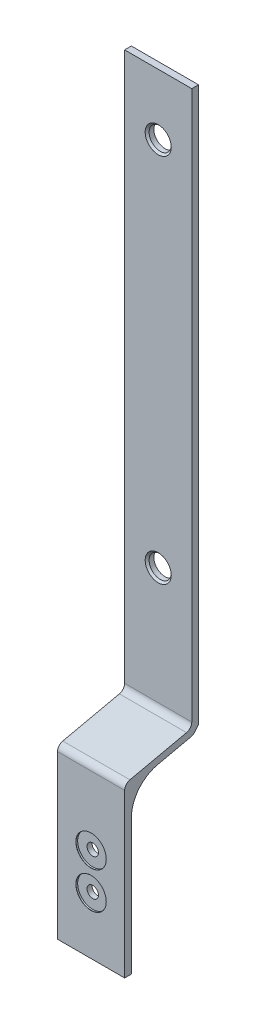
ISO-10303-21;
HEADER;
FILE_DESCRIPTION(('STEP AP214'),'2;1');
FILE_NAME('part.step','',(''),(''),'','','');
FILE_SCHEMA(('AUTOMOTIVE_DESIGN { 1 0 10303 214 1 1 1 1 }'));
ENDSEC;
DATA;
#1=APPLICATION_CONTEXT('core data for automotive mechanical design processes');
#2=APPLICATION_PROTOCOL_DEFINITION('international standard','automotive_design',2000,#1);
#3=PRODUCT_CONTEXT('',#1,'mechanical');
#4=PRODUCT('Part','Part','',(#3));
#5=PRODUCT_RELATED_PRODUCT_CATEGORY('part','',(#4));
#6=PRODUCT_DEFINITION_FORMATION('','',#4);
#7=PRODUCT_DEFINITION_CONTEXT('part definition',#1,'design');
#8=PRODUCT_DEFINITION('design','',#6,#7);
#9=PRODUCT_DEFINITION_SHAPE('','',#8);
#10=(LENGTH_UNIT() NAMED_UNIT(*) SI_UNIT(.MILLI.,.METRE.));
#11=(NAMED_UNIT(*) PLANE_ANGLE_UNIT() SI_UNIT($,.RADIAN.));
#12=(NAMED_UNIT(*) SI_UNIT($,.STERADIAN.) SOLID_ANGLE_UNIT());
#13=UNCERTAINTY_MEASURE_WITH_UNIT(LENGTH_MEASURE(1.E-05),#10,'distance_accuracy_value','');
#14=(GEOMETRIC_REPRESENTATION_CONTEXT(3) GLOBAL_UNCERTAINTY_ASSIGNED_CONTEXT((#13)) GLOBAL_UNIT_ASSIGNED_CONTEXT((#10,
#11,#12)) REPRESENTATION_CONTEXT('',''));
#15=CARTESIAN_POINT('',(0.,0.,0.));
#16=DIRECTION('',(0.,0.,1.));
#17=DIRECTION('',(1.,0.,0.));
#18=AXIS2_PLACEMENT_3D('',#15,#16,#17);
#19=CARTESIAN_POINT('',(-10.,-6.3803236087085,19.567706280451));
#20=DIRECTION('',(0.,-0.976360863108322,-0.216146859774489));
#21=DIRECTION('',(0.,0.216146859774489,-0.976360863108322));
#22=AXIS2_PLACEMENT_3D('',#19,#20,#21);
#23=PLANE('',#22);
#24=DIRECTION('',(0.,0.216146859774489,-0.976360863108322));
#25=VECTOR('',#24,1.);
#26=CARTESIAN_POINT('',(-10.,-6.3803236087085,19.567706280451));
#27=LINE('',#26,#25);
#28=CARTESIAN_POINT('',(-10.,-4.29796982515272,10.1614685977449));
#29=VERTEX_POINT('',#28);
#30=CARTESIAN_POINT('',(-10.,-2.10478080775789,0.25457508924133));
#31=VERTEX_POINT('',#30);
#32=EDGE_CURVE('E304',#29,#31,#27,.T.);
#33=ORIENTED_EDGE('',*,*,#32,.T.);
#34=DIRECTION('',(1.,0.,0.));
#35=VECTOR('',#34,1.);
#36=CARTESIAN_POINT('',(10.,-2.10478080775789,0.254575089241331));
#37=LINE('',#36,#35);
#38=CARTESIAN_POINT('',(10.,-2.10478080775789,0.25457508924133));
#39=VERTEX_POINT('',#38);
#40=EDGE_CURVE('E199',#31,#39,#37,.T.);
#41=ORIENTED_EDGE('',*,*,#40,.T.);
#42=DIRECTION('',(0.,0.216146859774489,-0.976360863108322));
#43=VECTOR('',#42,1.);
#44=CARTESIAN_POINT('',(10.,-6.3803236087085,19.567706280451));
#45=LINE('',#44,#43);
#46=CARTESIAN_POINT('',(10.,-4.29796982515272,10.1614685977449));
#47=VERTEX_POINT('',#46);
#48=EDGE_CURVE('E302',#47,#39,#45,.T.);
#49=ORIENTED_EDGE('',*,*,#48,.F.);
#50=DIRECTION('',(1.,0.,0.));
#51=VECTOR('',#50,1.);
#52=CARTESIAN_POINT('',(-10.,-4.29796982515272,10.1614685977449));
#53=LINE('',#52,#51);
#54=EDGE_CURVE('E415',#47,#29,#53,.F.);
#55=ORIENTED_EDGE('',*,*,#54,.T.);
#56=EDGE_LOOP('',(#33,#41,#49,#55));
#57=FACE_BOUND('',#56,.T.);
#58=ADVANCED_FACE('F44',(#57),#23,.T.);
#59=CARTESIAN_POINT('',(-10.,-4.42760188249185,20.));
#60=DIRECTION('',(0.,-0.976360863108322,-0.216146859774489));
#61=DIRECTION('',(0.,0.216146859774489,-0.976360863108322));
#62=AXIS2_PLACEMENT_3D('',#59,#60,#61);
#63=PLANE('',#62);
#64=DIRECTION('',(0.,0.216146859774489,-0.976360863108322));
#65=VECTOR('',#64,1.);
#66=CARTESIAN_POINT('',(10.,-4.42760188249185,20.));
#67=LINE('',#66,#65);
#68=CARTESIAN_POINT('',(10.,-4.08054291856589,18.432293719549));
#69=VERTEX_POINT('',#68);
#70=CARTESIAN_POINT('',(10.,-0.347058963925962,1.56770628045102));
#71=VERTEX_POINT('',#70);
#72=EDGE_CURVE('E309',#69,#71,#67,.T.);
#73=ORIENTED_EDGE('',*,*,#72,.T.);
#74=DIRECTION('',(1.,0.,0.));
#75=VECTOR('',#74,1.);
#76=CARTESIAN_POINT('',(-10.,-0.347058963925962,1.56770628045102));
#77=LINE('',#76,#75);
#78=CARTESIAN_POINT('',(-10.,-0.347058963925962,1.56770628045102));
#79=VERTEX_POINT('',#78);
#80=EDGE_CURVE('E67',#71,#79,#77,.F.);
#81=ORIENTED_EDGE('',*,*,#80,.T.);
#82=DIRECTION('',(0.,0.216146859774489,-0.976360863108322));
#83=VECTOR('',#82,1.);
#84=CARTESIAN_POINT('',(-10.,-4.42760188249185,20.));
#85=LINE('',#84,#83);
#86=CARTESIAN_POINT('',(-10.,-4.08054291856589,18.432293719549));
#87=VERTEX_POINT('',#86);
#88=EDGE_CURVE('E416',#87,#79,#85,.T.);
#89=ORIENTED_EDGE('',*,*,#88,.F.);
#90=DIRECTION('',(1.,0.,0.));
#91=VECTOR('',#90,1.);
#92=CARTESIAN_POINT('',(-10.,-4.08054291856589,18.432293719549));
#93=LINE('',#92,#91);
#94=EDGE_CURVE('E421',#87,#69,#93,.T.);
#95=ORIENTED_EDGE('',*,*,#94,.T.);
#96=EDGE_LOOP('',(#73,#81,#89,#95));
#97=FACE_BOUND('',#96,.T.);
#98=ADVANCED_FACE('F269',(#97),#63,.F.);
#99=CARTESIAN_POINT('',(-10.,0.,0.));
#100=DIRECTION('',(-1.,0.,0.));
#101=DIRECTION('',(0.,0.,1.));
#102=AXIS2_PLACEMENT_3D('',#99,#100,#101);
#103=PLANE('',#102);
#104=DIRECTION('',(0.,-0.779790632084821,0.626040390160855));
#105=VECTOR('',#104,1.);
#106=CARTESIAN_POINT('',(-10.,-0.976360863108322,-1.21614685977449));
#107=LINE('',#106,#105);
#108=CARTESIAN_POINT('',(-10.,0.,-2.));
#109=VERTEX_POINT('',#108);
#110=CARTESIAN_POINT('',(-10.,-1.40413986186296,-0.872712455379337));
#111=VERTEX_POINT('',#110);
#112=EDGE_CURVE('E187',#109,#111,#107,.T.);
#113=ORIENTED_EDGE('',*,*,#112,.T.);
#114=CARTESIAN_POINT('',(-10.,-0.152059081541245,0.686868808790309));
#115=DIRECTION('',(-1.,0.,0.));
#116=DIRECTION('',(0.,0.,1.));
#117=AXIS2_PLACEMENT_3D('',#114,#115,#116);
#118=CIRCLE('',#117,2.);
#119=EDGE_CURVE('E209',#111,#31,#118,.T.);
#120=ORIENTED_EDGE('',*,*,#119,.T.);
#121=ORIENTED_EDGE('',*,*,#32,.F.);
#122=CARTESIAN_POINT('',(-10.,-14.0615784562359,8.));
#123=DIRECTION('',(-1.,0.,0.));
#124=DIRECTION('',(0.,0.,1.));
#125=AXIS2_PLACEMENT_3D('',#122,#123,#124);
#126=CIRCLE('',#125,10.);
#127=CARTESIAN_POINT('',(-10.,-14.0615784562359,18.));
#128=VERTEX_POINT('',#127);
#129=EDGE_CURVE('E419',#29,#128,#126,.F.);
#130=ORIENTED_EDGE('',*,*,#129,.T.);
#131=DIRECTION('',(0.,-1.,0.));
#132=VECTOR('',#131,1.);
#133=CARTESIAN_POINT('',(-10.,-4.42760188249185,18.));
#134=LINE('',#133,#132);
#135=CARTESIAN_POINT('',(-10.,-54.4276018824919,18.));
#136=VERTEX_POINT('',#135);
#137=EDGE_CURVE('E398',#128,#136,#134,.T.);
#138=ORIENTED_EDGE('',*,*,#137,.T.);
#139=DIRECTION('',(0.,0.,1.));
#140=VECTOR('',#139,1.);
#141=CARTESIAN_POINT('',(-10.,-54.4276018824919,18.));
#142=LINE('',#141,#140);
#143=CARTESIAN_POINT('',(-10.,-54.4276018824919,20.));
#144=VERTEX_POINT('',#143);
#145=EDGE_CURVE('E313',#136,#144,#142,.T.);
#146=ORIENTED_EDGE('',*,*,#145,.T.);
#147=DIRECTION('',(0.,-1.,0.));
#148=VECTOR('',#147,1.);
#149=CARTESIAN_POINT('',(-10.,-4.42760188249185,20.));
#150=LINE('',#149,#148);
#151=CARTESIAN_POINT('',(-10.,-6.03326464478253,20.));
#152=VERTEX_POINT('',#151);
#153=EDGE_CURVE('E406',#152,#144,#150,.T.);
#154=ORIENTED_EDGE('',*,*,#153,.F.);
#155=CARTESIAN_POINT('',(-10.,-6.03326464478253,18.));
#156=DIRECTION('',(-1.,0.,0.));
#157=DIRECTION('',(0.,0.,1.));
#158=AXIS2_PLACEMENT_3D('',#155,#156,#157);
#159=CIRCLE('',#158,2.);
#160=EDGE_CURVE('E203',#152,#87,#159,.T.);
#161=ORIENTED_EDGE('',*,*,#160,.T.);
#162=ORIENTED_EDGE('',*,*,#88,.T.);
#163=CARTESIAN_POINT('',(-10.,1.60566276229068,2.));
#164=DIRECTION('',(-1.,0.,0.));
#165=DIRECTION('',(0.,0.,1.));
#166=AXIS2_PLACEMENT_3D('',#163,#164,#165);
#167=CIRCLE('',#166,2.);
#168=CARTESIAN_POINT('',(-10.,1.60566276229068,0.));
#169=VERTEX_POINT('',#168);
#170=EDGE_CURVE('E12',#79,#169,#167,.F.);
#171=ORIENTED_EDGE('',*,*,#170,.T.);
#172=DIRECTION('',(0.,1.,0.));
#173=VECTOR('',#172,1.);
#174=CARTESIAN_POINT('',(-10.,0.,0.));
#175=LINE('',#174,#173);
#176=CARTESIAN_POINT('',(-10.,165.,0.));
#177=VERTEX_POINT('',#176);
#178=EDGE_CURVE('E159',#169,#177,#175,.T.);
#179=ORIENTED_EDGE('',*,*,#178,.T.);
#180=DIRECTION('',(0.,0.,1.));
#181=VECTOR('',#180,1.);
#182=CARTESIAN_POINT('',(-10.,165.,-2.));
#183=LINE('',#182,#181);
#184=CARTESIAN_POINT('',(-10.,165.,-2.));
#185=VERTEX_POINT('',#184);
#186=EDGE_CURVE('E156',#185,#177,#183,.T.);
#187=ORIENTED_EDGE('',*,*,#186,.F.);
#188=DIRECTION('',(0.,1.,0.));
#189=VECTOR('',#188,1.);
#190=CARTESIAN_POINT('',(-10.,0.,-2.));
#191=LINE('',#190,#189);
#192=EDGE_CURVE('E142',#109,#185,#191,.T.);
#193=ORIENTED_EDGE('',*,*,#192,.F.);
#194=EDGE_LOOP('',(#113,#120,#121,#130,#138,#146,#154,#161,#162,#171,#179,#187,#193));
#195=FACE_BOUND('',#194,.T.);
#196=ADVANCED_FACE('F157',(#195),#103,.T.);
#197=CARTESIAN_POINT('',(10.,0.,0.));
#198=DIRECTION('',(-1.,0.,0.));
#199=DIRECTION('',(0.,0.,1.));
#200=AXIS2_PLACEMENT_3D('',#197,#198,#199);
#201=PLANE('',#200);
#202=ORIENTED_EDGE('',*,*,#48,.T.);
#203=CARTESIAN_POINT('',(10.,-0.152059081541245,0.686868808790309));
#204=DIRECTION('',(-1.,0.,0.));
#205=DIRECTION('',(0.,0.,1.));
#206=AXIS2_PLACEMENT_3D('',#203,#204,#205);
#207=CIRCLE('',#206,2.);
#208=CARTESIAN_POINT('',(10.,-1.40413986186296,-0.872712455379336));
#209=VERTEX_POINT('',#208);
#210=EDGE_CURVE('E202',#39,#209,#207,.F.);
#211=ORIENTED_EDGE('',*,*,#210,.T.);
#212=DIRECTION('',(0.,-0.779790632084821,0.626040390160855));
#213=VECTOR('',#212,1.);
#214=CARTESIAN_POINT('',(10.,0.,-2.));
#215=LINE('',#214,#213);
#216=CARTESIAN_POINT('',(10.,0.,-2.));
#217=VERTEX_POINT('',#216);
#218=EDGE_CURVE('E182',#217,#209,#215,.T.);
#219=ORIENTED_EDGE('',*,*,#218,.F.);
#220=DIRECTION('',(0.,1.,0.));
#221=VECTOR('',#220,1.);
#222=CARTESIAN_POINT('',(10.,0.,-2.));
#223=LINE('',#222,#221);
#224=CARTESIAN_POINT('',(10.,165.,-2.));
#225=VERTEX_POINT('',#224);
#226=EDGE_CURVE('E167',#217,#225,#223,.T.);
#227=ORIENTED_EDGE('',*,*,#226,.T.);
#228=DIRECTION('',(0.,0.,1.));
#229=VECTOR('',#228,1.);
#230=CARTESIAN_POINT('',(10.,165.,-2.));
#231=LINE('',#230,#229);
#232=CARTESIAN_POINT('',(10.,165.,0.));
#233=VERTEX_POINT('',#232);
#234=EDGE_CURVE('E163',#225,#233,#231,.T.);
#235=ORIENTED_EDGE('',*,*,#234,.T.);
#236=DIRECTION('',(0.,1.,0.));
#237=VECTOR('',#236,1.);
#238=CARTESIAN_POINT('',(10.,0.,0.));
#239=LINE('',#238,#237);
#240=CARTESIAN_POINT('',(10.,1.60566276229068,0.));
#241=VERTEX_POINT('',#240);
#242=EDGE_CURVE('E153',#241,#233,#239,.T.);
#243=ORIENTED_EDGE('',*,*,#242,.F.);
#244=CARTESIAN_POINT('',(10.,1.60566276229068,2.));
#245=DIRECTION('',(-1.,0.,0.));
#246=DIRECTION('',(0.,0.,1.));
#247=AXIS2_PLACEMENT_3D('',#244,#245,#246);
#248=CIRCLE('',#247,2.);
#249=EDGE_CURVE('E53',#241,#71,#248,.T.);
#250=ORIENTED_EDGE('',*,*,#249,.T.);
#251=ORIENTED_EDGE('',*,*,#72,.F.);
#252=CARTESIAN_POINT('',(10.,-6.03326464478253,18.));
#253=DIRECTION('',(-1.,0.,0.));
#254=DIRECTION('',(0.,0.,1.));
#255=AXIS2_PLACEMENT_3D('',#252,#253,#254);
#256=CIRCLE('',#255,2.);
#257=CARTESIAN_POINT('',(10.,-6.03326464478253,20.));
#258=VERTEX_POINT('',#257);
#259=EDGE_CURVE('E424',#69,#258,#256,.F.);
#260=ORIENTED_EDGE('',*,*,#259,.T.);
#261=DIRECTION('',(0.,1.,0.));
#262=VECTOR('',#261,1.);
#263=CARTESIAN_POINT('',(10.,-4.42760188249185,20.));
#264=LINE('',#263,#262);
#265=CARTESIAN_POINT('',(9.99999999999999,-54.4276018824919,20.));
#266=VERTEX_POINT('',#265);
#267=EDGE_CURVE('E186',#266,#258,#264,.T.);
#268=ORIENTED_EDGE('',*,*,#267,.F.);
#269=DIRECTION('',(0.,0.,1.));
#270=VECTOR('',#269,1.);
#271=CARTESIAN_POINT('',(9.99999999999999,-54.4276018824919,18.));
#272=LINE('',#271,#270);
#273=CARTESIAN_POINT('',(9.99999999999999,-54.4276018824919,18.));
#274=VERTEX_POINT('',#273);
#275=EDGE_CURVE('E310',#274,#266,#272,.T.);
#276=ORIENTED_EDGE('',*,*,#275,.F.);
#277=DIRECTION('',(0.,1.,0.));
#278=VECTOR('',#277,1.);
#279=CARTESIAN_POINT('',(10.,-4.42760188249185,18.));
#280=LINE('',#279,#278);
#281=CARTESIAN_POINT('',(10.,-14.0615784562359,18.));
#282=VERTEX_POINT('',#281);
#283=EDGE_CURVE('E396',#274,#282,#280,.T.);
#284=ORIENTED_EDGE('',*,*,#283,.T.);
#285=CARTESIAN_POINT('',(10.,-14.0615784562359,8.));
#286=DIRECTION('',(-1.,0.,0.));
#287=DIRECTION('',(0.,0.,1.));
#288=AXIS2_PLACEMENT_3D('',#285,#286,#287);
#289=CIRCLE('',#288,10.);
#290=EDGE_CURVE('E308',#282,#47,#289,.T.);
#291=ORIENTED_EDGE('',*,*,#290,.T.);
#292=EDGE_LOOP('',(#202,#211,#219,#227,#235,#243,#250,#251,#260,#268,#276,#284,#291));
#293=FACE_BOUND('',#292,.T.);
#294=ADVANCED_FACE('F305',(#293),#201,.F.);
#295=CARTESIAN_POINT('',(9.99999999999999,-54.4276018824919,18.));
#296=DIRECTION('',(0.,-1.,0.));
#297=DIRECTION('',(0.,0.,-1.));
#298=AXIS2_PLACEMENT_3D('',#295,#296,#297);
#299=PLANE('',#298);
#300=DIRECTION('',(1.,0.,0.));
#301=VECTOR('',#300,1.);
#302=CARTESIAN_POINT('',(9.99999999999999,-54.4276018824919,20.));
#303=LINE('',#302,#301);
#304=EDGE_CURVE('E399',#144,#266,#303,.T.);
#305=ORIENTED_EDGE('',*,*,#304,.F.);
#306=ORIENTED_EDGE('',*,*,#145,.F.);
#307=DIRECTION('',(1.,0.,0.));
#308=VECTOR('',#307,1.);
#309=CARTESIAN_POINT('',(9.99999999999999,-54.4276018824919,18.));
#310=LINE('',#309,#308);
#311=EDGE_CURVE('E401',#136,#274,#310,.T.);
#312=ORIENTED_EDGE('',*,*,#311,.T.);
#313=ORIENTED_EDGE('',*,*,#275,.T.);
#314=EDGE_LOOP('',(#305,#306,#312,#313));
#315=FACE_BOUND('',#314,.T.);
#316=ADVANCED_FACE('F335',(#315),#299,.T.);
#317=CARTESIAN_POINT('',(0.,0.,18.));
#318=DIRECTION('',(0.,0.,-1.));
#319=DIRECTION('',(-1.,0.,0.));
#320=AXIS2_PLACEMENT_3D('',#317,#318,#319);
#321=PLANE('',#320);
#322=CARTESIAN_POINT('',(0.,-26.530198890695,18.));
#323=DIRECTION('',(0.,0.,-1.));
#324=DIRECTION('',(-1.,0.,0.));
#325=AXIS2_PLACEMENT_3D('',#322,#323,#324);
#326=CIRCLE('',#325,1.7);
#327=CARTESIAN_POINT('',(-1.7,-26.530198890695,18.));
#328=VERTEX_POINT('',#327);
#329=EDGE_CURVE('E48',#328,#328,#326,.T.);
#330=ORIENTED_EDGE('',*,*,#329,.F.);
#331=EDGE_LOOP('',(#330));
#332=FACE_BOUND('',#331,.T.);
#333=CARTESIAN_POINT('',(0.,-37.480198890695,18.));
#334=DIRECTION('',(0.,0.,-1.));
#335=DIRECTION('',(-1.,0.,0.));
#336=AXIS2_PLACEMENT_3D('',#333,#334,#335);
#337=CIRCLE('',#336,1.7);
#338=CARTESIAN_POINT('',(-1.70000000000001,-37.480198890695,18.));
#339=VERTEX_POINT('',#338);
#340=EDGE_CURVE('E228',#339,#339,#337,.T.);
#341=ORIENTED_EDGE('',*,*,#340,.F.);
#342=EDGE_LOOP('',(#341));
#343=FACE_BOUND('',#342,.T.);
#344=ORIENTED_EDGE('',*,*,#137,.F.);
#345=DIRECTION('',(1.,0.,0.));
#346=VECTOR('',#345,1.);
#347=CARTESIAN_POINT('',(10.,-14.0615784562359,18.));
#348=LINE('',#347,#346);
#349=EDGE_CURVE('E412',#128,#282,#348,.T.);
#350=ORIENTED_EDGE('',*,*,#349,.T.);
#351=ORIENTED_EDGE('',*,*,#283,.F.);
#352=ORIENTED_EDGE('',*,*,#311,.F.);
#353=EDGE_LOOP('',(#344,#350,#351,#352));
#354=FACE_BOUND('',#353,.T.);
#355=ADVANCED_FACE('F370',(#332,#343,#354),#321,.T.);
#356=CARTESIAN_POINT('',(0.,0.,20.));
#357=DIRECTION('',(0.,0.,-1.));
#358=DIRECTION('',(-1.,0.,0.));
#359=AXIS2_PLACEMENT_3D('',#356,#357,#358);
#360=PLANE('',#359);
#361=CARTESIAN_POINT('',(0.,-26.530198890695,20.));
#362=DIRECTION('',(0.,0.,1.));
#363=DIRECTION('',(1.,0.,0.));
#364=AXIS2_PLACEMENT_3D('',#361,#362,#363);
#365=CIRCLE('',#364,4.525);
#366=CARTESIAN_POINT('',(4.525,-26.530198890695,20.));
#367=VERTEX_POINT('',#366);
#368=EDGE_CURVE('E575',#367,#367,#365,.T.);
#369=ORIENTED_EDGE('',*,*,#368,.F.);
#370=EDGE_LOOP('',(#369));
#371=FACE_BOUND('',#370,.T.);
#372=CARTESIAN_POINT('',(0.,-37.480198890695,20.));
#373=DIRECTION('',(0.,0.,1.));
#374=DIRECTION('',(1.,0.,0.));
#375=AXIS2_PLACEMENT_3D('',#372,#373,#374);
#376=CIRCLE('',#375,4.525);
#377=CARTESIAN_POINT('',(4.525,-37.480198890695,20.));
#378=VERTEX_POINT('',#377);
#379=EDGE_CURVE('E460',#378,#378,#376,.T.);
#380=ORIENTED_EDGE('',*,*,#379,.F.);
#381=EDGE_LOOP('',(#380));
#382=FACE_BOUND('',#381,.T.);
#383=ORIENTED_EDGE('',*,*,#267,.T.);
#384=DIRECTION('',(1.,0.,0.));
#385=VECTOR('',#384,1.);
#386=CARTESIAN_POINT('',(0.,-6.03326464478253,20.));
#387=LINE('',#386,#385);
#388=EDGE_CURVE('E426',#258,#152,#387,.F.);
#389=ORIENTED_EDGE('',*,*,#388,.T.);
#390=ORIENTED_EDGE('',*,*,#153,.T.);
#391=ORIENTED_EDGE('',*,*,#304,.T.);
#392=EDGE_LOOP('',(#383,#389,#390,#391));
#393=FACE_BOUND('',#392,.T.);
#394=ADVANCED_FACE('F282',(#371,#382,#393),#360,.F.);
#395=CARTESIAN_POINT('',(0.,-14.0615784562359,8.));
#396=DIRECTION('',(-1.,0.,0.));
#397=DIRECTION('',(0.,0.,1.));
#398=AXIS2_PLACEMENT_3D('',#395,#396,#397);
#399=CYLINDRICAL_SURFACE('',#398,10.);
#400=ORIENTED_EDGE('',*,*,#129,.F.);
#401=ORIENTED_EDGE('',*,*,#54,.F.);
#402=ORIENTED_EDGE('',*,*,#290,.F.);
#403=ORIENTED_EDGE('',*,*,#349,.F.);
#404=EDGE_LOOP('',(#400,#401,#402,#403));
#405=FACE_BOUND('',#404,.T.);
#406=ADVANCED_FACE('F278',(#405),#399,.F.);
#407=CARTESIAN_POINT('',(-10.,-6.03326464478253,18.));
#408=DIRECTION('',(1.,0.,0.));
#409=DIRECTION('',(0.,0.,-1.));
#410=AXIS2_PLACEMENT_3D('',#407,#408,#409);
#411=CYLINDRICAL_SURFACE('',#410,2.);
#412=ORIENTED_EDGE('',*,*,#160,.F.);
#413=ORIENTED_EDGE('',*,*,#388,.F.);
#414=ORIENTED_EDGE('',*,*,#259,.F.);
#415=ORIENTED_EDGE('',*,*,#94,.F.);
#416=EDGE_LOOP('',(#412,#413,#414,#415));
#417=FACE_BOUND('',#416,.T.);
#418=ADVANCED_FACE('F281',(#417),#411,.T.);
#419=CARTESIAN_POINT('',(0.,-0.976360863108322,-1.21614685977449));
#420=DIRECTION('',(0.,0.626040390160855,0.779790632084821));
#421=DIRECTION('',(0.,-0.779790632084821,0.626040390160855));
#422=AXIS2_PLACEMENT_3D('',#419,#420,#421);
#423=PLANE('',#422);
#424=ORIENTED_EDGE('',*,*,#218,.T.);
#425=DIRECTION('',(1.,0.,0.));
#426=VECTOR('',#425,1.);
#427=CARTESIAN_POINT('',(-10.,-1.40413986186296,-0.872712455379337));
#428=LINE('',#427,#426);
#429=EDGE_CURVE('E205',#209,#111,#428,.F.);
#430=ORIENTED_EDGE('',*,*,#429,.T.);
#431=ORIENTED_EDGE('',*,*,#112,.F.);
#432=DIRECTION('',(-1.,0.,0.));
#433=VECTOR('',#432,1.);
#434=CARTESIAN_POINT('',(10.,0.,-2.));
#435=LINE('',#434,#433);
#436=EDGE_CURVE('E149',#217,#109,#435,.T.);
#437=ORIENTED_EDGE('',*,*,#436,.F.);
#438=EDGE_LOOP('',(#424,#430,#431,#437));
#439=FACE_BOUND('',#438,.T.);
#440=ADVANCED_FACE('F285',(#439),#423,.F.);
#441=CARTESIAN_POINT('',(10.,165.,-2.));
#442=DIRECTION('',(0.,1.,0.));
#443=DIRECTION('',(0.,0.,1.));
#444=AXIS2_PLACEMENT_3D('',#441,#442,#443);
#445=PLANE('',#444);
#446=DIRECTION('',(-1.,0.,0.));
#447=VECTOR('',#446,1.);
#448=CARTESIAN_POINT('',(10.,165.,0.));
#449=LINE('',#448,#447);
#450=EDGE_CURVE('E174',#233,#177,#449,.T.);
#451=ORIENTED_EDGE('',*,*,#450,.F.);
#452=ORIENTED_EDGE('',*,*,#234,.F.);
#453=DIRECTION('',(-1.,0.,0.));
#454=VECTOR('',#453,1.);
#455=CARTESIAN_POINT('',(10.,165.,-2.));
#456=LINE('',#455,#454);
#457=EDGE_CURVE('E147',#225,#185,#456,.T.);
#458=ORIENTED_EDGE('',*,*,#457,.T.);
#459=ORIENTED_EDGE('',*,*,#186,.T.);
#460=EDGE_LOOP('',(#451,#452,#458,#459));
#461=FACE_BOUND('',#460,.T.);
#462=ADVANCED_FACE('F165',(#461),#445,.T.);
#463=CARTESIAN_POINT('',(0.,0.,-2.));
#464=DIRECTION('',(0.,0.,-1.));
#465=DIRECTION('',(-1.,0.,0.));
#466=AXIS2_PLACEMENT_3D('',#463,#464,#465);
#467=PLANE('',#466);
#468=CARTESIAN_POINT('',(0.,146.829705843678,-2.));
#469=DIRECTION('',(0.,0.,-1.));
#470=DIRECTION('',(-1.,0.,0.));
#471=AXIS2_PLACEMENT_3D('',#468,#469,#470);
#472=CIRCLE('',#471,3.29999999999999);
#473=CARTESIAN_POINT('',(-3.29999999999999,146.829705843678,-2.));
#474=VERTEX_POINT('',#473);
#475=EDGE_CURVE('E224',#474,#474,#472,.T.);
#476=ORIENTED_EDGE('',*,*,#475,.F.);
#477=EDGE_LOOP('',(#476));
#478=FACE_BOUND('',#477,.T.);
#479=CARTESIAN_POINT('',(0.,36.4098011093045,-2.));
#480=DIRECTION('',(0.,0.,-1.));
#481=DIRECTION('',(-1.,0.,0.));
#482=AXIS2_PLACEMENT_3D('',#479,#480,#481);
#483=CIRCLE('',#482,3.29999999999999);
#484=CARTESIAN_POINT('',(-3.29999999999999,36.4098011093045,-2.));
#485=VERTEX_POINT('',#484);
#486=EDGE_CURVE('E221',#485,#485,#483,.T.);
#487=ORIENTED_EDGE('',*,*,#486,.F.);
#488=EDGE_LOOP('',(#487));
#489=FACE_BOUND('',#488,.T.);
#490=ORIENTED_EDGE('',*,*,#436,.T.);
#491=ORIENTED_EDGE('',*,*,#192,.T.);
#492=ORIENTED_EDGE('',*,*,#457,.F.);
#493=ORIENTED_EDGE('',*,*,#226,.F.);
#494=EDGE_LOOP('',(#490,#491,#492,#493));
#495=FACE_BOUND('',#494,.T.);
#496=ADVANCED_FACE('F144',(#478,#489,#495),#467,.T.);
#497=CARTESIAN_POINT('',(0.,0.,0.));
#498=DIRECTION('',(0.,0.,-1.));
#499=DIRECTION('',(-1.,0.,0.));
#500=AXIS2_PLACEMENT_3D('',#497,#498,#499);
#501=PLANE('',#500);
#502=CARTESIAN_POINT('',(0.,146.829705843678,0.));
#503=DIRECTION('',(0.,0.,1.));
#504=DIRECTION('',(1.,0.,0.));
#505=AXIS2_PLACEMENT_3D('',#502,#503,#504);
#506=CIRCLE('',#505,3.8865);
#507=CARTESIAN_POINT('',(3.8865,146.829705843678,0.));
#508=VERTEX_POINT('',#507);
#509=EDGE_CURVE('E230',#508,#508,#506,.T.);
#510=ORIENTED_EDGE('',*,*,#509,.F.);
#511=EDGE_LOOP('',(#510));
#512=FACE_BOUND('',#511,.T.);
#513=CARTESIAN_POINT('',(0.,36.4098011093045,0.));
#514=DIRECTION('',(0.,0.,1.));
#515=DIRECTION('',(1.,0.,0.));
#516=AXIS2_PLACEMENT_3D('',#513,#514,#515);
#517=CIRCLE('',#516,3.8865);
#518=CARTESIAN_POINT('',(3.8865,36.4098011093045,0.));
#519=VERTEX_POINT('',#518);
#520=EDGE_CURVE('E226',#519,#519,#517,.T.);
#521=ORIENTED_EDGE('',*,*,#520,.F.);
#522=EDGE_LOOP('',(#521));
#523=FACE_BOUND('',#522,.T.);
#524=ORIENTED_EDGE('',*,*,#178,.F.);
#525=DIRECTION('',(1.,0.,0.));
#526=VECTOR('',#525,1.);
#527=CARTESIAN_POINT('',(10.,1.60566276229068,0.));
#528=LINE('',#527,#526);
#529=EDGE_CURVE('E211',#169,#241,#528,.T.);
#530=ORIENTED_EDGE('',*,*,#529,.T.);
#531=ORIENTED_EDGE('',*,*,#242,.T.);
#532=ORIENTED_EDGE('',*,*,#450,.T.);
#533=EDGE_LOOP('',(#524,#530,#531,#532));
#534=FACE_BOUND('',#533,.T.);
#535=ADVANCED_FACE('F289',(#512,#523,#534),#501,.F.);
#536=CARTESIAN_POINT('',(-10.,-0.152059081541245,0.686868808790309));
#537=DIRECTION('',(-1.,0.,0.));
#538=DIRECTION('',(0.,0.,1.));
#539=AXIS2_PLACEMENT_3D('',#536,#537,#538);
#540=CYLINDRICAL_SURFACE('',#539,2.);
#541=ORIENTED_EDGE('',*,*,#119,.F.);
#542=ORIENTED_EDGE('',*,*,#429,.F.);
#543=ORIENTED_EDGE('',*,*,#210,.F.);
#544=ORIENTED_EDGE('',*,*,#40,.F.);
#545=EDGE_LOOP('',(#541,#542,#543,#544));
#546=FACE_BOUND('',#545,.T.);
#547=ADVANCED_FACE('F287',(#546),#540,.T.);
#548=CARTESIAN_POINT('',(0.,1.60566276229068,2.));
#549=DIRECTION('',(-1.,0.,0.));
#550=DIRECTION('',(0.,0.,1.));
#551=AXIS2_PLACEMENT_3D('',#548,#549,#550);
#552=CYLINDRICAL_SURFACE('',#551,2.);
#553=ORIENTED_EDGE('',*,*,#170,.F.);
#554=ORIENTED_EDGE('',*,*,#80,.F.);
#555=ORIENTED_EDGE('',*,*,#249,.F.);
#556=ORIENTED_EDGE('',*,*,#529,.F.);
#557=EDGE_LOOP('',(#553,#554,#555,#556));
#558=FACE_BOUND('',#557,.T.);
#559=ADVANCED_FACE('F46',(#558),#552,.F.);
#560=CARTESIAN_POINT('',(0.,36.4098011093045,0.));
#561=DIRECTION('',(0.,0.,1.));
#562=DIRECTION('',(1.,0.,0.));
#563=AXIS2_PLACEMENT_3D('',#560,#561,#562);
#564=CYLINDRICAL_SURFACE('',#563,3.29999999999999);
#565=ORIENTED_EDGE('',*,*,#486,.T.);
#566=EDGE_LOOP('',(#565));
#567=FACE_BOUND('',#566,.T.);
#568=CARTESIAN_POINT('',(0.,36.4098011093045,-0.586500000000004));
#569=DIRECTION('',(0.,0.,1.));
#570=DIRECTION('',(1.,0.,0.));
#571=AXIS2_PLACEMENT_3D('',#568,#569,#570);
#572=CIRCLE('',#571,3.29999999999999);
#573=CARTESIAN_POINT('',(3.29999999999999,36.4098011093045,-0.586500000000004));
#574=VERTEX_POINT('',#573);
#575=EDGE_CURVE('E172',#574,#574,#572,.T.);
#576=ORIENTED_EDGE('',*,*,#575,.T.);
#577=EDGE_LOOP('',(#576));
#578=FACE_BOUND('',#577,.T.);
#579=ADVANCED_FACE('F253',(#567,#578),#564,.F.);
#580=CARTESIAN_POINT('',(0.,36.4098011093045,0.));
#581=DIRECTION('',(0.,0.,1.));
#582=DIRECTION('',(1.,0.,0.));
#583=AXIS2_PLACEMENT_3D('',#580,#581,#582);
#584=CONICAL_SURFACE('',#583,3.8865,0.785398163397454);
#585=ORIENTED_EDGE('',*,*,#575,.F.);
#586=EDGE_LOOP('',(#585));
#587=FACE_BOUND('',#586,.T.);
#588=ORIENTED_EDGE('',*,*,#520,.T.);
#589=EDGE_LOOP('',(#588));
#590=FACE_BOUND('',#589,.T.);
#591=ADVANCED_FACE('F255',(#587,#590),#584,.F.);
#592=CARTESIAN_POINT('',(0.,146.829705843678,0.));
#593=DIRECTION('',(0.,0.,1.));
#594=DIRECTION('',(1.,0.,0.));
#595=AXIS2_PLACEMENT_3D('',#592,#593,#594);
#596=CYLINDRICAL_SURFACE('',#595,3.29999999999999);
#597=ORIENTED_EDGE('',*,*,#475,.T.);
#598=EDGE_LOOP('',(#597));
#599=FACE_BOUND('',#598,.T.);
#600=CARTESIAN_POINT('',(0.,146.829705843678,-0.586500000000004));
#601=DIRECTION('',(0.,0.,1.));
#602=DIRECTION('',(1.,0.,0.));
#603=AXIS2_PLACEMENT_3D('',#600,#601,#602);
#604=CIRCLE('',#603,3.29999999999999);
#605=CARTESIAN_POINT('',(3.29999999999999,146.829705843678,-0.586500000000004));
#606=VERTEX_POINT('',#605);
#607=EDGE_CURVE('E227',#606,#606,#604,.T.);
#608=ORIENTED_EDGE('',*,*,#607,.T.);
#609=EDGE_LOOP('',(#608));
#610=FACE_BOUND('',#609,.T.);
#611=ADVANCED_FACE('F257',(#599,#610),#596,.F.);
#612=CARTESIAN_POINT('',(0.,146.829705843678,0.));
#613=DIRECTION('',(0.,0.,1.));
#614=DIRECTION('',(1.,0.,0.));
#615=AXIS2_PLACEMENT_3D('',#612,#613,#614);
#616=CONICAL_SURFACE('',#615,3.8865,0.785398163397454);
#617=ORIENTED_EDGE('',*,*,#607,.F.);
#618=EDGE_LOOP('',(#617));
#619=FACE_BOUND('',#618,.T.);
#620=ORIENTED_EDGE('',*,*,#509,.T.);
#621=EDGE_LOOP('',(#620));
#622=FACE_BOUND('',#621,.T.);
#623=ADVANCED_FACE('F263',(#619,#622),#616,.F.);
#624=CARTESIAN_POINT('',(0.,-37.480198890695,20.));
#625=DIRECTION('',(0.,0.,1.));
#626=DIRECTION('',(1.,0.,0.));
#627=AXIS2_PLACEMENT_3D('',#624,#625,#626);
#628=CYLINDRICAL_SURFACE('',#627,1.7);
#629=ORIENTED_EDGE('',*,*,#340,.T.);
#630=EDGE_LOOP('',(#629));
#631=FACE_BOUND('',#630,.T.);
#632=CARTESIAN_POINT('',(0.,-37.480198890695,19.5));
#633=DIRECTION('',(0.,0.,1.));
#634=DIRECTION('',(1.,0.,0.));
#635=AXIS2_PLACEMENT_3D('',#632,#633,#634);
#636=CIRCLE('',#635,1.70000000000001);
#637=CARTESIAN_POINT('',(1.70000000000001,-37.480198890695,19.5));
#638=VERTEX_POINT('',#637);
#639=EDGE_CURVE('E231',#638,#638,#636,.T.);
#640=ORIENTED_EDGE('',*,*,#639,.T.);
#641=EDGE_LOOP('',(#640));
#642=FACE_BOUND('',#641,.T.);
#643=ADVANCED_FACE('F498',(#631,#642),#628,.F.);
#644=CARTESIAN_POINT('',(4.49999999999999,-37.480198890695,19.5));
#645=DIRECTION('',(0.,0.,-1.));
#646=DIRECTION('',(-1.,0.,0.));
#647=AXIS2_PLACEMENT_3D('',#644,#645,#646);
#648=PLANE('',#647);
#649=ORIENTED_EDGE('',*,*,#639,.F.);
#650=EDGE_LOOP('',(#649));
#651=FACE_BOUND('',#650,.T.);
#652=CARTESIAN_POINT('',(0.,-37.480198890695,19.5));
#653=DIRECTION('',(0.,0.,1.));
#654=DIRECTION('',(1.,0.,0.));
#655=AXIS2_PLACEMENT_3D('',#652,#653,#654);
#656=CIRCLE('',#655,4.49999999999999);
#657=CARTESIAN_POINT('',(4.49999999999999,-37.480198890695,19.5));
#658=VERTEX_POINT('',#657);
#659=EDGE_CURVE('E237',#658,#658,#656,.T.);
#660=ORIENTED_EDGE('',*,*,#659,.T.);
#661=EDGE_LOOP('',(#660));
#662=FACE_BOUND('',#661,.T.);
#663=ADVANCED_FACE('F491',(#651,#662),#648,.F.);
#664=CARTESIAN_POINT('',(0.,-37.480198890695,20.));
#665=DIRECTION('',(0.,0.,1.));
#666=DIRECTION('',(1.,0.,0.));
#667=AXIS2_PLACEMENT_3D('',#664,#665,#666);
#668=CYLINDRICAL_SURFACE('',#667,4.49999999999999);
#669=ORIENTED_EDGE('',*,*,#659,.F.);
#670=EDGE_LOOP('',(#669));
#671=FACE_BOUND('',#670,.T.);
#672=CARTESIAN_POINT('',(0.,-37.480198890695,19.975));
#673=DIRECTION('',(0.,0.,1.));
#674=DIRECTION('',(1.,0.,0.));
#675=AXIS2_PLACEMENT_3D('',#672,#673,#674);
#676=CIRCLE('',#675,4.49999999999999);
#677=CARTESIAN_POINT('',(4.49999999999999,-37.480198890695,19.975));
#678=VERTEX_POINT('',#677);
#679=EDGE_CURVE('E242',#678,#678,#676,.T.);
#680=ORIENTED_EDGE('',*,*,#679,.T.);
#681=EDGE_LOOP('',(#680));
#682=FACE_BOUND('',#681,.T.);
#683=ADVANCED_FACE('F476',(#671,#682),#668,.F.);
#684=CARTESIAN_POINT('',(0.,-37.480198890695,20.));
#685=DIRECTION('',(0.,0.,1.));
#686=DIRECTION('',(1.,0.,0.));
#687=AXIS2_PLACEMENT_3D('',#684,#685,#686);
#688=CONICAL_SURFACE('',#687,4.525,0.785398163397518);
#689=ORIENTED_EDGE('',*,*,#679,.F.);
#690=EDGE_LOOP('',(#689));
#691=FACE_BOUND('',#690,.T.);
#692=ORIENTED_EDGE('',*,*,#379,.T.);
#693=EDGE_LOOP('',(#692));
#694=FACE_BOUND('',#693,.T.);
#695=ADVANCED_FACE('F478',(#691,#694),#688,.F.);
#696=CARTESIAN_POINT('',(0.,-26.530198890695,20.));
#697=DIRECTION('',(0.,0.,1.));
#698=DIRECTION('',(1.,0.,0.));
#699=AXIS2_PLACEMENT_3D('',#696,#697,#698);
#700=CYLINDRICAL_SURFACE('',#699,1.7);
#701=ORIENTED_EDGE('',*,*,#329,.T.);
#702=EDGE_LOOP('',(#701));
#703=FACE_BOUND('',#702,.T.);
#704=CARTESIAN_POINT('',(0.,-26.530198890695,19.5));
#705=DIRECTION('',(0.,0.,1.));
#706=DIRECTION('',(1.,0.,0.));
#707=AXIS2_PLACEMENT_3D('',#704,#705,#706);
#708=CIRCLE('',#707,1.70000000000001);
#709=CARTESIAN_POINT('',(1.70000000000001,-26.530198890695,19.5));
#710=VERTEX_POINT('',#709);
#711=EDGE_CURVE('E461',#710,#710,#708,.T.);
#712=ORIENTED_EDGE('',*,*,#711,.T.);
#713=EDGE_LOOP('',(#712));
#714=FACE_BOUND('',#713,.T.);
#715=ADVANCED_FACE('F481',(#703,#714),#700,.F.);
#716=CARTESIAN_POINT('',(4.49999999999999,-26.530198890695,19.5));
#717=DIRECTION('',(0.,0.,-1.));
#718=DIRECTION('',(-1.,0.,0.));
#719=AXIS2_PLACEMENT_3D('',#716,#717,#718);
#720=PLANE('',#719);
#721=ORIENTED_EDGE('',*,*,#711,.F.);
#722=EDGE_LOOP('',(#721));
#723=FACE_BOUND('',#722,.T.);
#724=CARTESIAN_POINT('',(0.,-26.530198890695,19.5));
#725=DIRECTION('',(0.,0.,1.));
#726=DIRECTION('',(1.,0.,0.));
#727=AXIS2_PLACEMENT_3D('',#724,#725,#726);
#728=CIRCLE('',#727,4.49999999999999);
#729=CARTESIAN_POINT('',(4.49999999999999,-26.530198890695,19.5));
#730=VERTEX_POINT('',#729);
#731=EDGE_CURVE('E465',#730,#730,#728,.T.);
#732=ORIENTED_EDGE('',*,*,#731,.T.);
#733=EDGE_LOOP('',(#732));
#734=FACE_BOUND('',#733,.T.);
#735=ADVANCED_FACE('F489',(#723,#734),#720,.F.);
#736=CARTESIAN_POINT('',(0.,-26.530198890695,20.));
#737=DIRECTION('',(0.,0.,1.));
#738=DIRECTION('',(1.,0.,0.));
#739=AXIS2_PLACEMENT_3D('',#736,#737,#738);
#740=CYLINDRICAL_SURFACE('',#739,4.49999999999999);
#741=ORIENTED_EDGE('',*,*,#731,.F.);
#742=EDGE_LOOP('',(#741));
#743=FACE_BOUND('',#742,.T.);
#744=CARTESIAN_POINT('',(0.,-26.530198890695,19.975));
#745=DIRECTION('',(0.,0.,1.));
#746=DIRECTION('',(1.,0.,0.));
#747=AXIS2_PLACEMENT_3D('',#744,#745,#746);
#748=CIRCLE('',#747,4.49999999999999);
#749=CARTESIAN_POINT('',(4.49999999999999,-26.530198890695,19.975));
#750=VERTEX_POINT('',#749);
#751=EDGE_CURVE('E470',#750,#750,#748,.T.);
#752=ORIENTED_EDGE('',*,*,#751,.T.);
#753=EDGE_LOOP('',(#752));
#754=FACE_BOUND('',#753,.T.);
#755=ADVANCED_FACE('F547',(#743,#754),#740,.F.);
#756=CARTESIAN_POINT('',(0.,-26.530198890695,20.));
#757=DIRECTION('',(0.,0.,1.));
#758=DIRECTION('',(1.,0.,0.));
#759=AXIS2_PLACEMENT_3D('',#756,#757,#758);
#760=CONICAL_SURFACE('',#759,4.525,0.785398163397518);
#761=ORIENTED_EDGE('',*,*,#751,.F.);
#762=EDGE_LOOP('',(#761));
#763=FACE_BOUND('',#762,.T.);
#764=ORIENTED_EDGE('',*,*,#368,.T.);
#765=EDGE_LOOP('',(#764));
#766=FACE_BOUND('',#765,.T.);
#767=ADVANCED_FACE('F556',(#763,#766),#760,.F.);
#768=CLOSED_SHELL('',(#58,#98,#196,#294,#316,#355,#394,#406,#418,#440,#462,#496,#535,#547,#559,
#579,#591,#611,#623,#643,#663,#683,#695,#715,#735,#755,#767));
#769=MANIFOLD_SOLID_BREP('B2',#768);
#770=ADVANCED_BREP_SHAPE_REPRESENTATION('',(#18,#769),#14);
#771=SHAPE_DEFINITION_REPRESENTATION(#9,#770);
ENDSEC;
END-ISO-10303-21;
